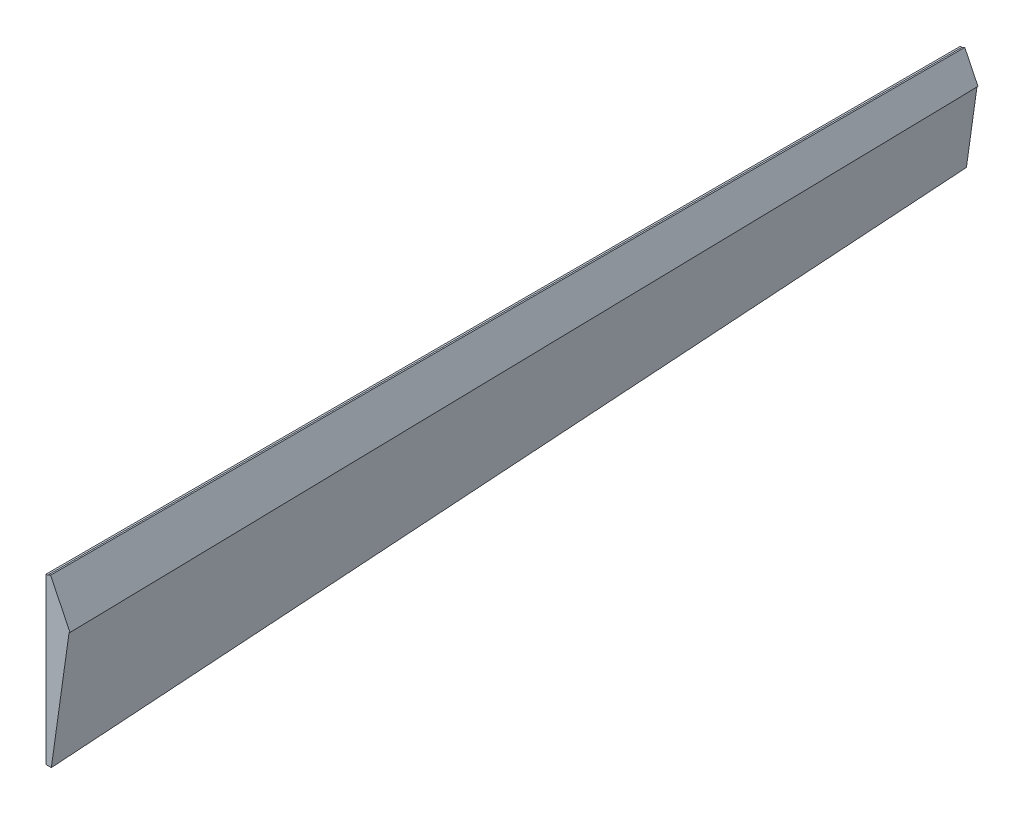
ISO-10303-21;
HEADER;
FILE_DESCRIPTION(('STEP AP214'),'2;1');
FILE_NAME('part.step','',(''),(''),'','','');
FILE_SCHEMA(('AUTOMOTIVE_DESIGN { 1 0 10303 214 1 1 1 1 }'));
ENDSEC;
DATA;
#1=APPLICATION_CONTEXT('core data for automotive mechanical design processes');
#2=APPLICATION_PROTOCOL_DEFINITION('international standard','automotive_design',2000,#1);
#3=PRODUCT_CONTEXT('',#1,'mechanical');
#4=PRODUCT('Part','Part','',(#3));
#5=PRODUCT_RELATED_PRODUCT_CATEGORY('part','',(#4));
#6=PRODUCT_DEFINITION_FORMATION('','',#4);
#7=PRODUCT_DEFINITION_CONTEXT('part definition',#1,'design');
#8=PRODUCT_DEFINITION('design','',#6,#7);
#9=PRODUCT_DEFINITION_SHAPE('','',#8);
#10=(LENGTH_UNIT() NAMED_UNIT(*) SI_UNIT(.MILLI.,.METRE.));
#11=(NAMED_UNIT(*) PLANE_ANGLE_UNIT() SI_UNIT($,.RADIAN.));
#12=(NAMED_UNIT(*) SI_UNIT($,.STERADIAN.) SOLID_ANGLE_UNIT());
#13=UNCERTAINTY_MEASURE_WITH_UNIT(LENGTH_MEASURE(1.E-05),#10,'distance_accuracy_value','');
#14=(GEOMETRIC_REPRESENTATION_CONTEXT(3) GLOBAL_UNCERTAINTY_ASSIGNED_CONTEXT((#13)) GLOBAL_UNIT_ASSIGNED_CONTEXT((#10,
#11,#12)) REPRESENTATION_CONTEXT('',''));
#15=CARTESIAN_POINT('',(0.,0.,0.));
#16=DIRECTION('',(0.,0.,1.));
#17=DIRECTION('',(1.,0.,0.));
#18=AXIS2_PLACEMENT_3D('',#15,#16,#17);
#19=CARTESIAN_POINT('',(0.,0.,575.24));
#20=DIRECTION('',(0.,0.,1.));
#21=DIRECTION('',(1.,0.,0.));
#22=AXIS2_PLACEMENT_3D('',#19,#20,#21);
#23=PLANE('',#22);
#24=DIRECTION('',(0.,-1.,0.));
#25=VECTOR('',#24,1.);
#26=CARTESIAN_POINT('',(0.,-103.762640376241,575.24));
#27=LINE('',#26,#25);
#28=CARTESIAN_POINT('',(0.,0.,575.24));
#29=VERTEX_POINT('',#28);
#30=CARTESIAN_POINT('',(0.,-103.762640376241,575.24));
#31=VERTEX_POINT('',#30);
#32=EDGE_CURVE('E305',#29,#31,#27,.T.);
#33=ORIENTED_EDGE('',*,*,#32,.T.);
#34=DIRECTION('',(1.,0.,0.));
#35=VECTOR('',#34,1.);
#36=CARTESIAN_POINT('',(0.,-103.762640376241,575.24));
#37=LINE('',#36,#35);
#38=CARTESIAN_POINT('',(3.35790610996718,-103.762640376241,575.24));
#39=VERTEX_POINT('',#38);
#40=EDGE_CURVE('E12',#31,#39,#37,.T.);
#41=ORIENTED_EDGE('',*,*,#40,.T.);
#42=DIRECTION('',(0.139460770441389,0.990227596822011,0.));
#43=VECTOR('',#42,1.);
#44=CARTESIAN_POINT('',(14.5198744351028,-24.5081730775128,575.24));
#45=LINE('',#44,#43);
#46=CARTESIAN_POINT('',(14.5198744351028,-24.5081730775128,575.24));
#47=VERTEX_POINT('',#46);
#48=EDGE_CURVE('E63',#39,#47,#45,.T.);
#49=ORIENTED_EDGE('',*,*,#48,.T.);
#50=DIRECTION('',(0.898794046299322,0.43837114678876,0.));
#51=VECTOR('',#50,1.);
#52=CARTESIAN_POINT('',(15.1042365420754,-24.2231606344195,575.24));
#53=LINE('',#52,#51);
#54=CARTESIAN_POINT('',(15.1042365420754,-24.2231606344195,575.24));
#55=VERTEX_POINT('',#54);
#56=EDGE_CURVE('E202',#47,#55,#53,.T.);
#57=ORIENTED_EDGE('',*,*,#56,.T.);
#58=DIRECTION('',(-0.438371146789047,0.898794046299182,0.));
#59=VECTOR('',#58,1.);
#60=CARTESIAN_POINT('',(2.86219591425196,0.876742293578897,575.24));
#61=LINE('',#60,#59);
#62=CARTESIAN_POINT('',(2.86219591425196,0.876742293578897,575.24));
#63=VERTEX_POINT('',#62);
#64=EDGE_CURVE('E416',#55,#63,#61,.T.);
#65=ORIENTED_EDGE('',*,*,#64,.T.);
#66=DIRECTION('',(-0.898794046298797,-0.438371146789836,0.));
#67=VECTOR('',#66,1.);
#68=CARTESIAN_POINT('',(1.06460782165596,0.,575.24));
#69=LINE('',#68,#67);
#70=CARTESIAN_POINT('',(1.06460782165596,0.,575.24));
#71=VERTEX_POINT('',#70);
#72=EDGE_CURVE('E77',#63,#71,#69,.T.);
#73=ORIENTED_EDGE('',*,*,#72,.T.);
#74=DIRECTION('',(-1.,0.,0.));
#75=VECTOR('',#74,1.);
#76=CARTESIAN_POINT('',(1.06460782165596,0.,575.24));
#77=LINE('',#76,#75);
#78=EDGE_CURVE('E71',#71,#29,#77,.T.);
#79=ORIENTED_EDGE('',*,*,#78,.T.);
#80=EDGE_LOOP('',(#33,#41,#49,#57,#65,#73,#79));
#81=FACE_BOUND('',#80,.T.);
#82=ADVANCED_FACE('F53',(#81),#23,.T.);
#83=CARTESIAN_POINT('',(0.,0.,0.));
#84=DIRECTION('',(0.,0.,1.));
#85=DIRECTION('',(1.,0.,0.));
#86=AXIS2_PLACEMENT_3D('',#83,#84,#85);
#87=PLANE('',#86);
#88=DIRECTION('',(0.,-1.,0.));
#89=VECTOR('',#88,1.);
#90=CARTESIAN_POINT('',(0.,0.,0.));
#91=LINE('',#90,#89);
#92=CARTESIAN_POINT('',(0.,0.,0.));
#93=VERTEX_POINT('',#92);
#94=CARTESIAN_POINT('',(0.,-64.046772385962,0.));
#95=VERTEX_POINT('',#94);
#96=EDGE_CURVE('E119',#93,#95,#91,.T.);
#97=ORIENTED_EDGE('',*,*,#96,.F.);
#98=DIRECTION('',(-1.,0.,0.));
#99=VECTOR('',#98,1.);
#100=CARTESIAN_POINT('',(1.06460782164959,0.,0.));
#101=LINE('',#100,#99);
#102=CARTESIAN_POINT('',(1.06460782164959,0.,0.));
#103=VERTEX_POINT('',#102);
#104=EDGE_CURVE('E258',#103,#93,#101,.T.);
#105=ORIENTED_EDGE('',*,*,#104,.F.);
#106=DIRECTION('',(-0.89879404629915,-0.438371146789111,0.));
#107=VECTOR('',#106,1.);
#108=CARTESIAN_POINT('',(1.06460782164959,0.,0.));
#109=LINE('',#108,#107);
#110=CARTESIAN_POINT('',(2.86219591424742,0.876742293577995,0.));
#111=VERTEX_POINT('',#110);
#112=EDGE_CURVE('E264',#111,#103,#109,.T.);
#113=ORIENTED_EDGE('',*,*,#112,.F.);
#114=DIRECTION('',(-0.438371146789031,0.89879404629919,0.));
#115=VECTOR('',#114,1.);
#116=CARTESIAN_POINT('',(2.86219591424742,0.876742293577995,0.));
#117=LINE('',#116,#115);
#118=CARTESIAN_POINT('',(11.199107472188,-16.2164595005766,0.));
#119=VERTEX_POINT('',#118);
#120=EDGE_CURVE('E247',#119,#111,#117,.T.);
#121=ORIENTED_EDGE('',*,*,#120,.F.);
#122=DIRECTION('',(0.898794046298879,0.438371146789669,0.));
#123=VECTOR('',#122,1.);
#124=CARTESIAN_POINT('',(10.5895381668288,-16.5137663157902,0.));
#125=LINE('',#124,#123);
#126=CARTESIAN_POINT('',(10.5895381668288,-16.5137663157902,0.));
#127=VERTEX_POINT('',#126);
#128=EDGE_CURVE('E364',#127,#119,#125,.T.);
#129=ORIENTED_EDGE('',*,*,#128,.F.);
#130=DIRECTION('',(0.139173100960094,0.990268068741566,0.));
#131=VECTOR('',#130,1.);
#132=CARTESIAN_POINT('',(3.90920981781164,-64.046772385962,0.));
#133=LINE('',#132,#131);
#134=CARTESIAN_POINT('',(3.90920981781164,-64.046772385962,0.));
#135=VERTEX_POINT('',#134);
#136=EDGE_CURVE('E122',#135,#127,#133,.T.);
#137=ORIENTED_EDGE('',*,*,#136,.F.);
#138=DIRECTION('',(1.,0.,0.));
#139=VECTOR('',#138,1.);
#140=CARTESIAN_POINT('',(0.,-64.046772385962,0.));
#141=LINE('',#140,#139);
#142=EDGE_CURVE('E115',#95,#135,#141,.T.);
#143=ORIENTED_EDGE('',*,*,#142,.F.);
#144=EDGE_LOOP('',(#97,#105,#113,#121,#129,#137,#143));
#145=FACE_BOUND('',#144,.T.);
#146=ADVANCED_FACE('F118',(#145),#87,.F.);
#147=CARTESIAN_POINT('',(2.65761101448273,1.2962034994947,0.));
#148=DIRECTION('',(-0.898794046299182,-0.438371146789047,0.));
#149=DIRECTION('',(0.438371146789047,-0.898794046299182,0.));
#150=AXIS2_PLACEMENT_3D('',#147,#148,#149);
#151=PLANE('',#150);
#152=DIRECTION('',(0.,0.,1.));
#153=VECTOR('',#152,1.);
#154=CARTESIAN_POINT('',(2.86219591424742,0.876742293577995,0.));
#155=LINE('',#154,#153);
#156=EDGE_CURVE('E239',#111,#63,#155,.T.);
#157=ORIENTED_EDGE('',*,*,#156,.T.);
#158=ORIENTED_EDGE('',*,*,#64,.F.);
#159=DIRECTION('',(0.00678788138255794,-0.0139172192748251,0.999880110650268));
#160=VECTOR('',#159,1.);
#161=CARTESIAN_POINT('',(11.199107472188,-16.2164595005766,0.));
#162=LINE('',#161,#160);
#163=EDGE_CURVE('E232',#119,#55,#162,.T.);
#164=ORIENTED_EDGE('',*,*,#163,.F.);
#165=ORIENTED_EDGE('',*,*,#120,.T.);
#166=EDGE_LOOP('',(#157,#158,#164,#165));
#167=FACE_BOUND('',#166,.T.);
#168=ADVANCED_FACE('F220',(#167),#151,.F.);
#169=CARTESIAN_POINT('',(8.53944851155828,-17.5084640882322,-0.301670064478112));
#170=DIRECTION('',(-0.43831859075703,0.898686290465568,0.015484325171193));
#171=DIRECTION('',(-0.898794046299322,-0.43837114678876,0.));
#172=AXIS2_PLACEMENT_3D('',#169,#170,#171);
#173=PLANE('',#172);
#174=ORIENTED_EDGE('',*,*,#163,.T.);
#175=ORIENTED_EDGE('',*,*,#56,.F.);
#176=DIRECTION('',(0.0068316964365222,-0.0138958492246652,0.999880109462192));
#177=VECTOR('',#176,1.);
#178=CARTESIAN_POINT('',(12.5547063009658,-20.5109696966515,287.62));
#179=LINE('',#178,#177);
#180=EDGE_CURVE('E147',#127,#47,#179,.T.);
#181=ORIENTED_EDGE('',*,*,#180,.F.);
#182=ORIENTED_EDGE('',*,*,#128,.T.);
#183=EDGE_LOOP('',(#174,#175,#181,#182));
#184=FACE_BOUND('',#183,.T.);
#185=ADVANCED_FACE('F209',(#184),#173,.F.);
#186=CARTESIAN_POINT('',(0.204584899765492,-0.419461205917405,0.));
#187=DIRECTION('',(0.438371146789836,-0.898794046298797,0.));
#188=DIRECTION('',(0.898794046298797,0.438371146789836,0.));
#189=AXIS2_PLACEMENT_3D('',#186,#187,#188);
#190=PLANE('',#189);
#191=DIRECTION('',(0.,0.,1.));
#192=VECTOR('',#191,1.);
#193=CARTESIAN_POINT('',(1.06460782164959,0.,0.));
#194=LINE('',#193,#192);
#195=EDGE_CURVE('E149',#103,#71,#194,.T.);
#196=ORIENTED_EDGE('',*,*,#195,.T.);
#197=ORIENTED_EDGE('',*,*,#72,.F.);
#198=ORIENTED_EDGE('',*,*,#156,.F.);
#199=ORIENTED_EDGE('',*,*,#112,.T.);
#200=EDGE_LOOP('',(#196,#197,#198,#199));
#201=FACE_BOUND('',#200,.T.);
#202=ADVANCED_FACE('F219',(#201),#190,.F.);
#203=CARTESIAN_POINT('',(0.,0.,0.));
#204=DIRECTION('',(0.,-1.,0.));
#205=DIRECTION('',(0.,0.,-1.));
#206=AXIS2_PLACEMENT_3D('',#203,#204,#205);
#207=PLANE('',#206);
#208=DIRECTION('',(0.,0.,1.));
#209=VECTOR('',#208,1.);
#210=CARTESIAN_POINT('',(0.,0.,0.));
#211=LINE('',#210,#209);
#212=EDGE_CURVE('E138',#93,#29,#211,.T.);
#213=ORIENTED_EDGE('',*,*,#212,.T.);
#214=ORIENTED_EDGE('',*,*,#78,.F.);
#215=ORIENTED_EDGE('',*,*,#195,.F.);
#216=ORIENTED_EDGE('',*,*,#104,.T.);
#217=EDGE_LOOP('',(#213,#214,#215,#216));
#218=FACE_BOUND('',#217,.T.);
#219=ADVANCED_FACE('F276',(#218),#207,.F.);
#220=CARTESIAN_POINT('',(0.,0.,0.));
#221=DIRECTION('',(1.,0.,0.));
#222=DIRECTION('',(0.,0.,-1.));
#223=AXIS2_PLACEMENT_3D('',#220,#221,#222);
#224=PLANE('',#223);
#225=DIRECTION('',(0.,-0.0688782866464584,0.997625070669662));
#226=VECTOR('',#225,1.);
#227=CARTESIAN_POINT('',(0.,-64.046772385962,0.));
#228=LINE('',#227,#226);
#229=EDGE_CURVE('E135',#95,#31,#228,.T.);
#230=ORIENTED_EDGE('',*,*,#229,.T.);
#231=ORIENTED_EDGE('',*,*,#32,.F.);
#232=ORIENTED_EDGE('',*,*,#212,.F.);
#233=ORIENTED_EDGE('',*,*,#96,.T.);
#234=EDGE_LOOP('',(#230,#231,#232,#233));
#235=FACE_BOUND('',#234,.T.);
#236=ADVANCED_FACE('F134',(#235),#224,.F.);
#237=CARTESIAN_POINT('',(0.,-63.7429205117827,-4.40095510806061));
#238=DIRECTION('',(0.,0.997625070669662,0.0688782866464584));
#239=DIRECTION('',(0.,-0.0688782866464584,0.997625070669662));
#240=AXIS2_PLACEMENT_3D('',#237,#238,#239);
#241=PLANE('',#240);
#242=DIRECTION('',(-0.000956112490629523,-0.0688782551638706,0.997624614679533));
#243=VECTOR('',#242,1.);
#244=CARTESIAN_POINT('',(3.90920981781164,-64.046772385962,0.));
#245=LINE('',#244,#243);
#246=EDGE_CURVE('E145',#135,#39,#245,.T.);
#247=ORIENTED_EDGE('',*,*,#246,.T.);
#248=ORIENTED_EDGE('',*,*,#40,.F.);
#249=ORIENTED_EDGE('',*,*,#229,.F.);
#250=ORIENTED_EDGE('',*,*,#142,.T.);
#251=EDGE_LOOP('',(#247,#248,#249,#250));
#252=FACE_BOUND('',#251,.T.);
#253=ADVANCED_FACE('F143',(#252),#241,.F.);
#254=CARTESIAN_POINT('',(3.90920981781164,-64.046772385962,0.));
#255=CARTESIAN_POINT('',(3.35790610996718,-103.762640376241,575.24));
#256=CARTESIAN_POINT('',(5.02259787598116,-56.1246047076,0.));
#257=CARTESIAN_POINT('',(5.21823416415645,-90.5535624931193,575.24));
#258=CARTESIAN_POINT('',(6.13598593415068,-48.2024370292381,0.));
#259=CARTESIAN_POINT('',(7.07856221834572,-77.344484609998,575.24));
#260=CARTESIAN_POINT('',(8.36276205048973,-32.3581016725142,0.));
#261=CARTESIAN_POINT('',(10.7992183267243,-50.9263288437554,575.24));
#262=CARTESIAN_POINT('',(9.47615010865926,-24.4359339941522,0.));
#263=CARTESIAN_POINT('',(12.6595463809135,-37.7172509606341,575.24));
#264=CARTESIAN_POINT('',(10.5895381668288,-16.5137663157902,0.));
#265=CARTESIAN_POINT('',(14.5198744351028,-24.5081730775128,575.24));
#266=B_SPLINE_SURFACE_WITH_KNOTS('',3,1,((#254,#255),(#256,#257),(#258,#259),(#260,#261),(#262,
#263),(#264,#265)),.UNSPECIFIED.,.F.,.F.,.F.,(4,2,4),(2,2),(0.,0.5,1.),(0.,1.),.UNSPECIFIED.);
#267=ORIENTED_EDGE('',*,*,#136,.T.);
#268=ORIENTED_EDGE('',*,*,#180,.T.);
#269=ORIENTED_EDGE('',*,*,#48,.F.);
#270=ORIENTED_EDGE('',*,*,#246,.F.);
#271=EDGE_LOOP('',(#267,#268,#269,#270));
#272=FACE_BOUND('',#271,.T.);
#273=ADVANCED_FACE('F168',(#272),#266,.T.);
#274=CLOSED_SHELL('',(#82,#146,#168,#185,#202,#219,#236,#253,#273));
#275=MANIFOLD_SOLID_BREP('B2',#274);
#276=ADVANCED_BREP_SHAPE_REPRESENTATION('',(#18,#275),#14);
#277=SHAPE_DEFINITION_REPRESENTATION(#9,#276);
ENDSEC;
END-ISO-10303-21;
